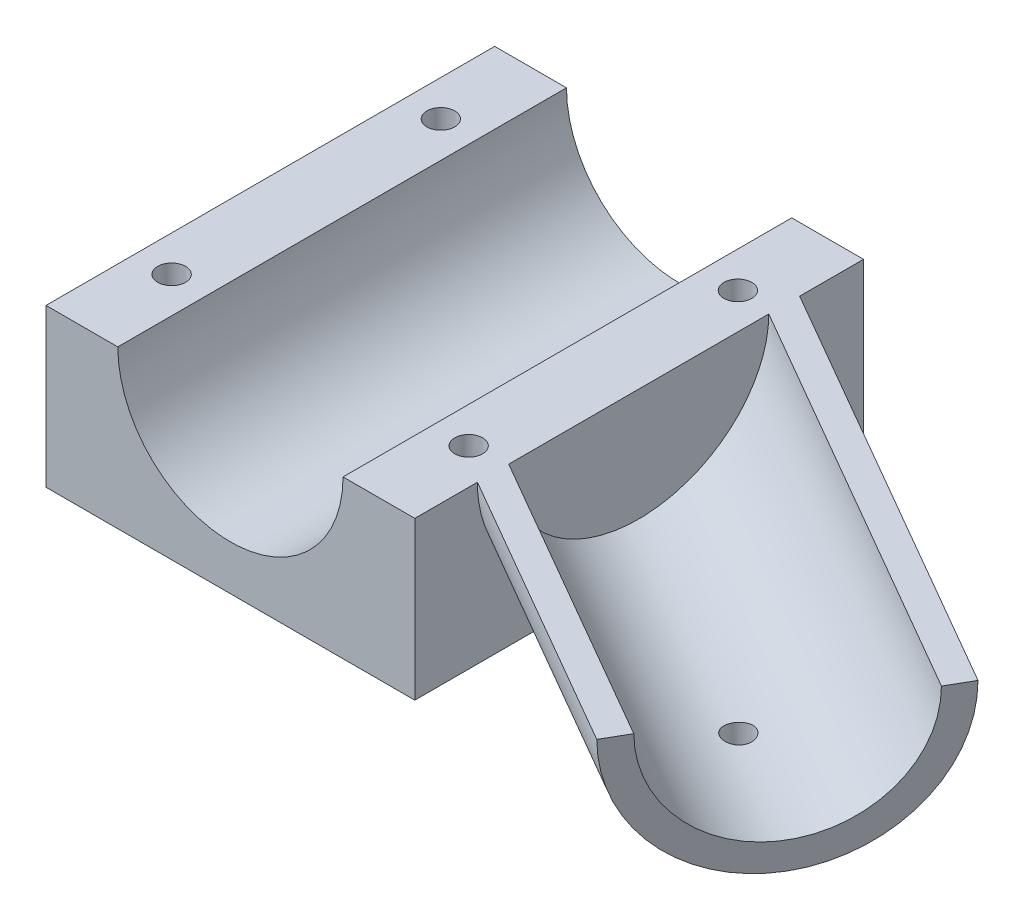
ISO-10303-21;
HEADER;
FILE_DESCRIPTION(('STEP AP214'),'2;1');
FILE_NAME('part.step','',(''),(''),'','','');
FILE_SCHEMA(('AUTOMOTIVE_DESIGN { 1 0 10303 214 1 1 1 1 }'));
ENDSEC;
DATA;
#1=APPLICATION_CONTEXT('core data for automotive mechanical design processes');
#2=APPLICATION_PROTOCOL_DEFINITION('international standard','automotive_design',2000,#1);
#3=PRODUCT_CONTEXT('',#1,'mechanical');
#4=PRODUCT('Part','Part','',(#3));
#5=PRODUCT_RELATED_PRODUCT_CATEGORY('part','',(#4));
#6=PRODUCT_DEFINITION_FORMATION('','',#4);
#7=PRODUCT_DEFINITION_CONTEXT('part definition',#1,'design');
#8=PRODUCT_DEFINITION('design','',#6,#7);
#9=PRODUCT_DEFINITION_SHAPE('','',#8);
#10=(LENGTH_UNIT() NAMED_UNIT(*) SI_UNIT(.MILLI.,.METRE.));
#11=(NAMED_UNIT(*) PLANE_ANGLE_UNIT() SI_UNIT($,.RADIAN.));
#12=(NAMED_UNIT(*) SI_UNIT($,.STERADIAN.) SOLID_ANGLE_UNIT());
#13=UNCERTAINTY_MEASURE_WITH_UNIT(LENGTH_MEASURE(1.E-05),#10,'distance_accuracy_value','');
#14=(GEOMETRIC_REPRESENTATION_CONTEXT(3) GLOBAL_UNCERTAINTY_ASSIGNED_CONTEXT((#13)) GLOBAL_UNIT_ASSIGNED_CONTEXT((#10,
#11,#12)) REPRESENTATION_CONTEXT('',''));
#15=CARTESIAN_POINT('',(0.,0.,0.));
#16=DIRECTION('',(0.,0.,1.));
#17=DIRECTION('',(1.,0.,0.));
#18=AXIS2_PLACEMENT_3D('',#15,#16,#17);
#19=CARTESIAN_POINT('',(20.55,0.,25.));
#20=DIRECTION('',(-1.,0.,0.));
#21=DIRECTION('',(0.,0.,1.));
#22=AXIS2_PLACEMENT_3D('',#19,#20,#21);
#23=PLANE('',#22);
#24=CARTESIAN_POINT('',(20.55,17.55,0.0688461692518183));
#25=DIRECTION('',(-1.,0.,0.));
#26=DIRECTION('',(0.,0.,1.));
#27=AXIS2_PLACEMENT_3D('',#24,#25,#26);
#28=ELLIPSE('',#27,17.9555933717974,15.55);
#29=CARTESIAN_POINT('',(20.55,17.55,18.0244395410492));
#30=VERTEX_POINT('',#29);
#31=CARTESIAN_POINT('',(20.55,17.55,-17.8867472025455));
#32=VERTEX_POINT('',#31);
#33=EDGE_CURVE('E136',#30,#32,#28,.F.);
#34=ORIENTED_EDGE('',*,*,#33,.F.);
#35=DIRECTION('',(0.,0.,-1.));
#36=VECTOR('',#35,1.);
#37=CARTESIAN_POINT('',(20.55,17.55,25.));
#38=LINE('',#37,#36);
#39=CARTESIAN_POINT('',(20.55,17.55,25.));
#40=VERTEX_POINT('',#39);
#41=EDGE_CURVE('E122',#40,#30,#38,.T.);
#42=ORIENTED_EDGE('',*,*,#41,.F.);
#43=DIRECTION('',(0.,1.,0.));
#44=VECTOR('',#43,1.);
#45=CARTESIAN_POINT('',(20.55,0.,25.));
#46=LINE('',#45,#44);
#47=CARTESIAN_POINT('',(20.55,0.,25.));
#48=VERTEX_POINT('',#47);
#49=EDGE_CURVE('E190',#48,#40,#46,.T.);
#50=ORIENTED_EDGE('',*,*,#49,.F.);
#51=DIRECTION('',(0.,0.,-1.));
#52=VECTOR('',#51,1.);
#53=CARTESIAN_POINT('',(20.55,0.,25.));
#54=LINE('',#53,#52);
#55=CARTESIAN_POINT('',(20.55,0.,-25.));
#56=VERTEX_POINT('',#55);
#57=EDGE_CURVE('E214',#48,#56,#54,.T.);
#58=ORIENTED_EDGE('',*,*,#57,.T.);
#59=DIRECTION('',(0.,1.,0.));
#60=VECTOR('',#59,1.);
#61=CARTESIAN_POINT('',(20.55,0.,-25.));
#62=LINE('',#61,#60);
#63=CARTESIAN_POINT('',(20.55,17.55,-25.));
#64=VERTEX_POINT('',#63);
#65=EDGE_CURVE('E203',#56,#64,#62,.T.);
#66=ORIENTED_EDGE('',*,*,#65,.T.);
#67=EDGE_CURVE('E57',#32,#64,#38,.T.);
#68=ORIENTED_EDGE('',*,*,#67,.F.);
#69=EDGE_LOOP('',(#34,#42,#50,#58,#66,#68));
#70=FACE_BOUND('',#69,.T.);
#71=ADVANCED_FACE('F36',(#70),#23,.F.);
#72=CARTESIAN_POINT('',(20.55,17.55,0.0459838096834968));
#73=DIRECTION('',(-1.,0.,0.));
#74=DIRECTION('',(0.,0.,1.));
#75=AXIS2_PLACEMENT_3D('',#72,#73,#74);
#76=ELLIPSE('',#75,14.4914917566596,12.55);
#77=CARTESIAN_POINT('',(20.55,17.55,-14.4455079469761));
#78=VERTEX_POINT('',#77);
#79=CARTESIAN_POINT('',(20.55,17.55,14.5374755663431));
#80=VERTEX_POINT('',#79);
#81=EDGE_CURVE('E64',#78,#80,#76,.T.);
#82=ORIENTED_EDGE('',*,*,#81,.F.);
#83=EDGE_CURVE('E116',#80,#78,#38,.T.);
#84=ORIENTED_EDGE('',*,*,#83,.F.);
#85=EDGE_LOOP('',(#82,#84));
#86=FACE_BOUND('',#85,.T.);
#87=ADVANCED_FACE('F118',(#86),#23,.F.);
#88=CARTESIAN_POINT('',(-20.55,17.55,25.));
#89=DIRECTION('',(0.,-1.,0.));
#90=DIRECTION('',(0.,0.,-1.));
#91=AXIS2_PLACEMENT_3D('',#88,#89,#90);
#92=PLANE('',#91);
#93=CARTESIAN_POINT('',(-16.55,17.55,15.));
#94=DIRECTION('',(0.,1.,0.));
#95=DIRECTION('',(0.,0.,1.));
#96=AXIS2_PLACEMENT_3D('',#93,#94,#95);
#97=CIRCLE('',#96,1.55);
#98=CARTESIAN_POINT('',(-16.55,17.55,16.55));
#99=VERTEX_POINT('',#98);
#100=EDGE_CURVE('E157',#99,#99,#97,.T.);
#101=ORIENTED_EDGE('',*,*,#100,.F.);
#102=EDGE_LOOP('',(#101));
#103=FACE_BOUND('',#102,.T.);
#104=CARTESIAN_POINT('',(-16.55,17.55,-15.));
#105=DIRECTION('',(0.,1.,0.));
#106=DIRECTION('',(0.,0.,1.));
#107=AXIS2_PLACEMENT_3D('',#104,#105,#106);
#108=CIRCLE('',#107,1.55);
#109=CARTESIAN_POINT('',(-16.55,17.55,-13.45));
#110=VERTEX_POINT('',#109);
#111=EDGE_CURVE('E165',#110,#110,#108,.T.);
#112=ORIENTED_EDGE('',*,*,#111,.F.);
#113=EDGE_LOOP('',(#112));
#114=FACE_BOUND('',#113,.T.);
#115=DIRECTION('',(-1.,0.,0.));
#116=VECTOR('',#115,1.);
#117=CARTESIAN_POINT('',(-20.55,17.55,-25.));
#118=LINE('',#117,#116);
#119=CARTESIAN_POINT('',(-12.55,17.55,-25.));
#120=VERTEX_POINT('',#119);
#121=CARTESIAN_POINT('',(-20.55,17.55,-25.));
#122=VERTEX_POINT('',#121);
#123=EDGE_CURVE('E181',#120,#122,#118,.T.);
#124=ORIENTED_EDGE('',*,*,#123,.T.);
#125=DIRECTION('',(0.,0.,-1.));
#126=VECTOR('',#125,1.);
#127=CARTESIAN_POINT('',(-20.55,17.55,25.));
#128=LINE('',#127,#126);
#129=CARTESIAN_POINT('',(-20.55,17.55,25.));
#130=VERTEX_POINT('',#129);
#131=EDGE_CURVE('E11',#130,#122,#128,.T.);
#132=ORIENTED_EDGE('',*,*,#131,.F.);
#133=DIRECTION('',(-1.,0.,0.));
#134=VECTOR('',#133,1.);
#135=CARTESIAN_POINT('',(-20.55,17.55,25.));
#136=LINE('',#135,#134);
#137=CARTESIAN_POINT('',(-12.55,17.55,25.));
#138=VERTEX_POINT('',#137);
#139=EDGE_CURVE('E182',#138,#130,#136,.T.);
#140=ORIENTED_EDGE('',*,*,#139,.F.);
#141=DIRECTION('',(0.,0.,-1.));
#142=VECTOR('',#141,1.);
#143=CARTESIAN_POINT('',(-12.55,17.55,25.));
#144=LINE('',#143,#142);
#145=EDGE_CURVE('E196',#138,#120,#144,.T.);
#146=ORIENTED_EDGE('',*,*,#145,.T.);
#147=EDGE_LOOP('',(#124,#132,#140,#146));
#148=FACE_BOUND('',#147,.T.);
#149=ADVANCED_FACE('F38',(#103,#114,#148),#92,.F.);
#150=CARTESIAN_POINT('',(-20.55,17.55,25.));
#151=DIRECTION('',(1.,0.,0.));
#152=DIRECTION('',(0.,0.,-1.));
#153=AXIS2_PLACEMENT_3D('',#150,#151,#152);
#154=PLANE('',#153);
#155=DIRECTION('',(0.,-1.,0.));
#156=VECTOR('',#155,1.);
#157=CARTESIAN_POINT('',(-20.55,17.55,-25.));
#158=LINE('',#157,#156);
#159=CARTESIAN_POINT('',(-20.55,0.,-25.));
#160=VERTEX_POINT('',#159);
#161=EDGE_CURVE('E199',#122,#160,#158,.T.);
#162=ORIENTED_EDGE('',*,*,#161,.T.);
#163=DIRECTION('',(0.,0.,-1.));
#164=VECTOR('',#163,1.);
#165=CARTESIAN_POINT('',(-20.55,0.,25.));
#166=LINE('',#165,#164);
#167=CARTESIAN_POINT('',(-20.55,0.,25.));
#168=VERTEX_POINT('',#167);
#169=EDGE_CURVE('E50',#168,#160,#166,.T.);
#170=ORIENTED_EDGE('',*,*,#169,.F.);
#171=DIRECTION('',(0.,-1.,0.));
#172=VECTOR('',#171,1.);
#173=CARTESIAN_POINT('',(-20.55,17.55,25.));
#174=LINE('',#173,#172);
#175=EDGE_CURVE('E185',#130,#168,#174,.T.);
#176=ORIENTED_EDGE('',*,*,#175,.F.);
#177=ORIENTED_EDGE('',*,*,#131,.T.);
#178=EDGE_LOOP('',(#162,#170,#176,#177));
#179=FACE_BOUND('',#178,.T.);
#180=ADVANCED_FACE('F239',(#179),#154,.F.);
#181=CARTESIAN_POINT('',(-20.55,0.,25.));
#182=DIRECTION('',(0.,1.,0.));
#183=DIRECTION('',(0.,0.,1.));
#184=AXIS2_PLACEMENT_3D('',#181,#182,#183);
#185=PLANE('',#184);
#186=CARTESIAN_POINT('',(-16.55,0.,15.));
#187=DIRECTION('',(0.,1.,0.));
#188=DIRECTION('',(0.,0.,1.));
#189=AXIS2_PLACEMENT_3D('',#186,#187,#188);
#190=CIRCLE('',#189,1.55);
#191=CARTESIAN_POINT('',(-16.55,0.,16.55));
#192=VERTEX_POINT('',#191);
#193=EDGE_CURVE('E169',#192,#192,#190,.F.);
#194=ORIENTED_EDGE('',*,*,#193,.F.);
#195=EDGE_LOOP('',(#194));
#196=FACE_BOUND('',#195,.T.);
#197=CARTESIAN_POINT('',(16.55,0.,15.));
#198=DIRECTION('',(0.,1.,0.));
#199=DIRECTION('',(0.,0.,1.));
#200=AXIS2_PLACEMENT_3D('',#197,#198,#199);
#201=CIRCLE('',#200,1.55);
#202=CARTESIAN_POINT('',(16.55,0.,16.55));
#203=VERTEX_POINT('',#202);
#204=EDGE_CURVE('E162',#203,#203,#201,.F.);
#205=ORIENTED_EDGE('',*,*,#204,.F.);
#206=EDGE_LOOP('',(#205));
#207=FACE_BOUND('',#206,.T.);
#208=CARTESIAN_POINT('',(16.55,0.,-15.));
#209=DIRECTION('',(0.,1.,0.));
#210=DIRECTION('',(0.,0.,1.));
#211=AXIS2_PLACEMENT_3D('',#208,#209,#210);
#212=CIRCLE('',#211,1.55);
#213=CARTESIAN_POINT('',(16.55,0.,-13.45));
#214=VERTEX_POINT('',#213);
#215=EDGE_CURVE('E161',#214,#214,#212,.F.);
#216=ORIENTED_EDGE('',*,*,#215,.F.);
#217=EDGE_LOOP('',(#216));
#218=FACE_BOUND('',#217,.T.);
#219=CARTESIAN_POINT('',(-16.55,0.,-15.));
#220=DIRECTION('',(0.,1.,0.));
#221=DIRECTION('',(0.,0.,1.));
#222=AXIS2_PLACEMENT_3D('',#219,#220,#221);
#223=CIRCLE('',#222,1.55);
#224=CARTESIAN_POINT('',(-16.55,0.,-13.45));
#225=VERTEX_POINT('',#224);
#226=EDGE_CURVE('E178',#225,#225,#223,.F.);
#227=ORIENTED_EDGE('',*,*,#226,.F.);
#228=EDGE_LOOP('',(#227));
#229=FACE_BOUND('',#228,.T.);
#230=DIRECTION('',(1.,0.,0.));
#231=VECTOR('',#230,1.);
#232=CARTESIAN_POINT('',(-20.55,0.,-25.));
#233=LINE('',#232,#231);
#234=EDGE_CURVE('E201',#160,#56,#233,.T.);
#235=ORIENTED_EDGE('',*,*,#234,.T.);
#236=ORIENTED_EDGE('',*,*,#57,.F.);
#237=DIRECTION('',(1.,0.,0.));
#238=VECTOR('',#237,1.);
#239=CARTESIAN_POINT('',(-20.55,0.,25.));
#240=LINE('',#239,#238);
#241=EDGE_CURVE('E188',#168,#48,#240,.T.);
#242=ORIENTED_EDGE('',*,*,#241,.F.);
#243=ORIENTED_EDGE('',*,*,#169,.T.);
#244=EDGE_LOOP('',(#235,#236,#242,#243));
#245=FACE_BOUND('',#244,.T.);
#246=ADVANCED_FACE('F222',(#196,#207,#218,#229,#245),#185,.F.);
#247=CARTESIAN_POINT('',(20.55,17.55,25.));
#248=DIRECTION('',(0.,-1.,0.));
#249=DIRECTION('',(0.,0.,-1.));
#250=AXIS2_PLACEMENT_3D('',#247,#248,#249);
#251=PLANE('',#250);
#252=CARTESIAN_POINT('',(16.55,17.55,15.));
#253=DIRECTION('',(0.,1.,0.));
#254=DIRECTION('',(0.,0.,1.));
#255=AXIS2_PLACEMENT_3D('',#252,#253,#254);
#256=CIRCLE('',#255,1.55);
#257=CARTESIAN_POINT('',(16.55,17.55,16.55));
#258=VERTEX_POINT('',#257);
#259=EDGE_CURVE('E166',#258,#258,#256,.T.);
#260=ORIENTED_EDGE('',*,*,#259,.F.);
#261=EDGE_LOOP('',(#260));
#262=FACE_BOUND('',#261,.T.);
#263=CARTESIAN_POINT('',(16.55,17.55,-15.));
#264=DIRECTION('',(0.,1.,0.));
#265=DIRECTION('',(0.,0.,1.));
#266=AXIS2_PLACEMENT_3D('',#263,#264,#265);
#267=CIRCLE('',#266,1.55);
#268=CARTESIAN_POINT('',(16.55,17.55,-13.45));
#269=VERTEX_POINT('',#268);
#270=EDGE_CURVE('E158',#269,#269,#267,.T.);
#271=ORIENTED_EDGE('',*,*,#270,.F.);
#272=EDGE_LOOP('',(#271));
#273=FACE_BOUND('',#272,.T.);
#274=DIRECTION('',(-1.,0.,0.));
#275=VECTOR('',#274,1.);
#276=CARTESIAN_POINT('',(20.55,17.55,-25.));
#277=LINE('',#276,#275);
#278=CARTESIAN_POINT('',(12.55,17.55,-25.));
#279=VERTEX_POINT('',#278);
#280=EDGE_CURVE('E205',#64,#279,#277,.T.);
#281=ORIENTED_EDGE('',*,*,#280,.T.);
#282=DIRECTION('',(0.,0.,-1.));
#283=VECTOR('',#282,1.);
#284=CARTESIAN_POINT('',(12.55,17.55,25.));
#285=LINE('',#284,#283);
#286=CARTESIAN_POINT('',(12.55,17.55,25.));
#287=VERTEX_POINT('',#286);
#288=EDGE_CURVE('E210',#287,#279,#285,.T.);
#289=ORIENTED_EDGE('',*,*,#288,.F.);
#290=DIRECTION('',(-1.,0.,0.));
#291=VECTOR('',#290,1.);
#292=CARTESIAN_POINT('',(20.55,17.55,25.));
#293=LINE('',#292,#291);
#294=EDGE_CURVE('E192',#40,#287,#293,.T.);
#295=ORIENTED_EDGE('',*,*,#294,.F.);
#296=ORIENTED_EDGE('',*,*,#41,.T.);
#297=DIRECTION('',(-0.866025403784438,0.,-0.500000000000001));
#298=VECTOR('',#297,1.);
#299=CARTESIAN_POINT('',(52.0175340371084,17.55,36.1922287881075));
#300=LINE('',#299,#298);
#301=CARTESIAN_POINT('',(52.0175340371084,17.55,36.1922287881075));
#302=VERTEX_POINT('',#301);
#303=EDGE_CURVE('E133',#302,#30,#300,.T.);
#304=ORIENTED_EDGE('',*,*,#303,.F.);
#305=DIRECTION('',(-0.500000000000001,0.,0.866025403784438));
#306=VECTOR('',#305,1.);
#307=CARTESIAN_POINT('',(52.0175340371084,17.55,36.1922287881075));
#308=LINE('',#307,#306);
#309=CARTESIAN_POINT('',(53.5274337291968,17.55,33.5770058070779));
#310=VERTEX_POINT('',#309);
#311=EDGE_CURVE('E129',#310,#302,#308,.T.);
#312=ORIENTED_EDGE('',*,*,#311,.F.);
#313=DIRECTION('',(-0.866025403784438,0.,-0.500000000000001));
#314=VECTOR('',#313,1.);
#315=CARTESIAN_POINT('',(53.5274337291968,17.55,33.5770058070779));
#316=LINE('',#315,#314);
#317=EDGE_CURVE('E126',#310,#80,#316,.T.);
#318=ORIENTED_EDGE('',*,*,#317,.T.);
#319=ORIENTED_EDGE('',*,*,#83,.T.);
#320=DIRECTION('',(-0.866025403784438,0.,-0.500000000000001));
#321=VECTOR('',#320,1.);
#322=CARTESIAN_POINT('',(66.0774337291968,17.55,11.8397681720886));
#323=LINE('',#322,#321);
#324=CARTESIAN_POINT('',(66.0774337291968,17.55,11.8397681720886));
#325=VERTEX_POINT('',#324);
#326=EDGE_CURVE('E132',#325,#78,#323,.T.);
#327=ORIENTED_EDGE('',*,*,#326,.F.);
#328=DIRECTION('',(-0.500000000000001,0.,0.866025403784438));
#329=VECTOR('',#328,1.);
#330=CARTESIAN_POINT('',(66.0774337291968,17.55,11.8397681720886));
#331=LINE('',#330,#329);
#332=CARTESIAN_POINT('',(67.5675340371085,17.55,9.25883873041148));
#333=VERTEX_POINT('',#332);
#334=EDGE_CURVE('E147',#333,#325,#331,.T.);
#335=ORIENTED_EDGE('',*,*,#334,.F.);
#336=DIRECTION('',(-0.866025403784438,0.,-0.500000000000001));
#337=VECTOR('',#336,1.);
#338=CARTESIAN_POINT('',(67.5675340371085,17.55,9.25883873041148));
#339=LINE('',#338,#337);
#340=EDGE_CURVE('E155',#333,#32,#339,.T.);
#341=ORIENTED_EDGE('',*,*,#340,.T.);
#342=ORIENTED_EDGE('',*,*,#67,.T.);
#343=EDGE_LOOP('',(#281,#289,#295,#296,#304,#312,#318,#319,#327,#335,#341,#342));
#344=FACE_BOUND('',#343,.T.);
#345=ADVANCED_FACE('F127',(#262,#273,#344),#251,.F.);
#346=CARTESIAN_POINT('',(0.,17.55,25.));
#347=DIRECTION('',(0.,0.,-1.));
#348=DIRECTION('',(-1.,0.,0.));
#349=AXIS2_PLACEMENT_3D('',#346,#347,#348);
#350=CYLINDRICAL_SURFACE('',#349,12.55);
#351=CARTESIAN_POINT('',(0.,17.55,-25.));
#352=DIRECTION('',(0.,0.,-1.));
#353=DIRECTION('',(1.,0.,0.));
#354=AXIS2_PLACEMENT_3D('',#351,#352,#353);
#355=CIRCLE('',#354,12.55);
#356=EDGE_CURVE('E186',#279,#120,#355,.T.);
#357=ORIENTED_EDGE('',*,*,#356,.T.);
#358=ORIENTED_EDGE('',*,*,#145,.F.);
#359=CARTESIAN_POINT('',(0.,17.55,25.));
#360=DIRECTION('',(0.,0.,-1.));
#361=DIRECTION('',(1.,0.,0.));
#362=AXIS2_PLACEMENT_3D('',#359,#360,#361);
#363=CIRCLE('',#362,12.55);
#364=EDGE_CURVE('E194',#287,#138,#363,.T.);
#365=ORIENTED_EDGE('',*,*,#364,.F.);
#366=ORIENTED_EDGE('',*,*,#288,.T.);
#367=EDGE_LOOP('',(#357,#358,#365,#366));
#368=FACE_BOUND('',#367,.T.);
#369=ADVANCED_FACE('F243',(#368),#350,.F.);
#370=CARTESIAN_POINT('',(0.,17.55,25.));
#371=DIRECTION('',(0.,0.,1.));
#372=DIRECTION('',(1.,0.,0.));
#373=AXIS2_PLACEMENT_3D('',#370,#371,#372);
#374=PLANE('',#373);
#375=ORIENTED_EDGE('',*,*,#139,.T.);
#376=ORIENTED_EDGE('',*,*,#175,.T.);
#377=ORIENTED_EDGE('',*,*,#241,.T.);
#378=ORIENTED_EDGE('',*,*,#49,.T.);
#379=ORIENTED_EDGE('',*,*,#294,.T.);
#380=ORIENTED_EDGE('',*,*,#364,.T.);
#381=EDGE_LOOP('',(#375,#376,#377,#378,#379,#380));
#382=FACE_BOUND('',#381,.T.);
#383=ADVANCED_FACE('F235',(#382),#374,.T.);
#384=CARTESIAN_POINT('',(0.,17.55,-25.));
#385=DIRECTION('',(0.,0.,1.));
#386=DIRECTION('',(1.,0.,0.));
#387=AXIS2_PLACEMENT_3D('',#384,#385,#386);
#388=PLANE('',#387);
#389=ORIENTED_EDGE('',*,*,#123,.F.);
#390=ORIENTED_EDGE('',*,*,#356,.F.);
#391=ORIENTED_EDGE('',*,*,#280,.F.);
#392=ORIENTED_EDGE('',*,*,#65,.F.);
#393=ORIENTED_EDGE('',*,*,#234,.F.);
#394=ORIENTED_EDGE('',*,*,#161,.F.);
#395=EDGE_LOOP('',(#389,#390,#391,#392,#393,#394));
#396=FACE_BOUND('',#395,.T.);
#397=ADVANCED_FACE('F228',(#396),#388,.F.);
#398=CARTESIAN_POINT('',(16.55,-4.38406204335659,-15.));
#399=DIRECTION('',(0.,1.,0.));
#400=DIRECTION('',(0.,0.,1.));
#401=AXIS2_PLACEMENT_3D('',#398,#399,#400);
#402=CYLINDRICAL_SURFACE('',#401,1.55);
#403=ORIENTED_EDGE('',*,*,#215,.T.);
#404=EDGE_LOOP('',(#403));
#405=FACE_BOUND('',#404,.T.);
#406=ORIENTED_EDGE('',*,*,#270,.T.);
#407=EDGE_LOOP('',(#406));
#408=FACE_BOUND('',#407,.T.);
#409=ADVANCED_FACE('F294',(#405,#408),#402,.F.);
#410=CARTESIAN_POINT('',(16.55,-4.38406204335659,15.));
#411=DIRECTION('',(0.,1.,0.));
#412=DIRECTION('',(0.,0.,1.));
#413=AXIS2_PLACEMENT_3D('',#410,#411,#412);
#414=CYLINDRICAL_SURFACE('',#413,1.55);
#415=ORIENTED_EDGE('',*,*,#204,.T.);
#416=EDGE_LOOP('',(#415));
#417=FACE_BOUND('',#416,.T.);
#418=ORIENTED_EDGE('',*,*,#259,.T.);
#419=EDGE_LOOP('',(#418));
#420=FACE_BOUND('',#419,.T.);
#421=ADVANCED_FACE('F285',(#417,#420),#414,.F.);
#422=CARTESIAN_POINT('',(-16.55,-4.38406204335659,-15.));
#423=DIRECTION('',(0.,1.,0.));
#424=DIRECTION('',(0.,0.,1.));
#425=AXIS2_PLACEMENT_3D('',#422,#423,#424);
#426=CYLINDRICAL_SURFACE('',#425,1.55);
#427=ORIENTED_EDGE('',*,*,#226,.T.);
#428=EDGE_LOOP('',(#427));
#429=FACE_BOUND('',#428,.T.);
#430=ORIENTED_EDGE('',*,*,#111,.T.);
#431=EDGE_LOOP('',(#430));
#432=FACE_BOUND('',#431,.T.);
#433=ADVANCED_FACE('F282',(#429,#432),#426,.F.);
#434=CARTESIAN_POINT('',(-16.55,-4.38406204335659,15.));
#435=DIRECTION('',(0.,1.,0.));
#436=DIRECTION('',(0.,0.,1.));
#437=AXIS2_PLACEMENT_3D('',#434,#435,#436);
#438=CYLINDRICAL_SURFACE('',#437,1.55);
#439=ORIENTED_EDGE('',*,*,#193,.T.);
#440=EDGE_LOOP('',(#439));
#441=FACE_BOUND('',#440,.T.);
#442=ORIENTED_EDGE('',*,*,#100,.T.);
#443=EDGE_LOOP('',(#442));
#444=FACE_BOUND('',#443,.T.);
#445=ADVANCED_FACE('F284',(#441,#444),#438,.F.);
#446=CARTESIAN_POINT('',(59.7925340371085,17.55,22.7255337592595));
#447=DIRECTION('',(-0.866025403784438,0.,-0.500000000000001));
#448=DIRECTION('',(-0.500000000000001,0.,0.866025403784438));
#449=AXIS2_PLACEMENT_3D('',#446,#447,#448);
#450=CYLINDRICAL_SURFACE('',#449,15.55);
#451=CARTESIAN_POINT('',(45.2620526724303,2.01834934625878,15.2083869895832));
#452=CARTESIAN_POINT('',(45.2620562797275,2.01469685331987,15.1216323159421));
#453=CARTESIAN_POINT('',(45.2693595591901,2.01141369707547,15.0348059463757));
#454=CARTESIAN_POINT('',(45.2984092968145,2.00596566590557,14.863501746858));
#455=CARTESIAN_POINT('',(45.3201708331823,2.0038019626281,14.7790264647302));
#456=CARTESIAN_POINT('',(45.3775378676029,2.0008482573498,14.6149070166333));
#457=CARTESIAN_POINT('',(45.4131394806538,2.00005787019022,14.5352615021625));
#458=CARTESIAN_POINT('',(45.4971698744395,1.99994831567961,14.3830761834491));
#459=CARTESIAN_POINT('',(45.5455957650445,2.0006288170905,14.3105347832347));
#460=CARTESIAN_POINT('',(45.6537851281487,2.00339023484947,14.1747342481469));
#461=CARTESIAN_POINT('',(45.7135260188987,2.00546838258569,14.1114570628718));
#462=CARTESIAN_POINT('',(45.8427100654244,2.01079922202937,13.9957895357711));
#463=CARTESIAN_POINT('',(45.9121537145492,2.01405197347437,13.9433997478662));
#464=CARTESIAN_POINT('',(46.0589566095821,2.02138712782917,13.8508549263606));
#465=CARTESIAN_POINT('',(46.1363343937672,2.02547149681544,13.8107294605233));
#466=CARTESIAN_POINT('',(46.296694929329,2.03401722611677,13.7439931720733));
#467=CARTESIAN_POINT('',(46.3796778318781,2.03847859660054,13.717382714131));
#468=CARTESIAN_POINT('',(46.5492899821705,2.04730598860176,13.6783345054542));
#469=CARTESIAN_POINT('',(46.6359331261437,2.05167152890846,13.665956971203));
#470=CARTESIAN_POINT('',(46.8100961426893,2.05980062841057,13.655935926056));
#471=CARTESIAN_POINT('',(46.8976160106948,2.0635641907399,13.658292338452));
#472=CARTESIAN_POINT('',(47.0710094109769,2.0700647347612,13.6776853282408));
#473=CARTESIAN_POINT('',(47.1568837630541,2.0728022409573,13.6947143904734));
#474=CARTESIAN_POINT('',(47.3245774277355,2.07694349879175,13.7429756769033));
#475=CARTESIAN_POINT('',(47.406396865137,2.07834729150172,13.7742074636849));
#476=CARTESIAN_POINT('',(47.5632724308306,2.07965856171468,13.8498155763005));
#477=CARTESIAN_POINT('',(47.6383575569829,2.07957279834668,13.8941316293251));
#478=CARTESIAN_POINT('',(47.7800402799468,2.07793126424763,13.9946956627242));
#479=CARTESIAN_POINT('',(47.8466379623178,2.07637550833646,14.0509435228026));
#480=CARTESIAN_POINT('',(47.9693665149924,2.07197283546201,14.1736675495795));
#481=CARTESIAN_POINT('',(48.0255133285082,2.06912790833663,14.240127849265));
#482=CARTESIAN_POINT('',(48.1259028598735,2.06246526594468,14.3814581452478));
#483=CARTESIAN_POINT('',(48.1701452698596,2.05864752552485,14.4563283589655));
#484=CARTESIAN_POINT('',(48.2456485146686,2.05044659466772,14.6126786646428));
#485=CARTESIAN_POINT('',(48.2768587907157,2.04606128689742,14.6941830604155));
#486=CARTESIAN_POINT('',(48.3251853150968,2.03722287689576,14.8612659301236));
#487=CARTESIAN_POINT('',(48.3423012508168,2.03276977316292,14.94684449438));
#488=CARTESIAN_POINT('',(48.3619868709628,2.02427308323591,15.1199664296992));
#489=CARTESIAN_POINT('',(48.3645085862336,2.02023089036184,15.2075153316566));
#490=CARTESIAN_POINT('',(48.3547898427005,2.01302026345162,15.3818268146634));
#491=CARTESIAN_POINT('',(48.342549621369,2.00985181536073,15.4685894083393));
#492=CARTESIAN_POINT('',(48.3036816353209,2.0047436420867,15.6386590553296));
#493=CARTESIAN_POINT('',(48.2770869193939,2.00280111662275,15.7219735747));
#494=CARTESIAN_POINT('',(48.2102770134152,2.00034338035155,15.8829713764081));
#495=CARTESIAN_POINT('',(48.1700622172103,1.99982812827634,15.9606548214987));
#496=CARTESIAN_POINT('',(48.0773595729914,2.00027267259672,16.1078488454185));
#497=CARTESIAN_POINT('',(48.0249244757904,2.00122622520313,16.177392674746));
#498=CARTESIAN_POINT('',(47.9091851000029,2.00448066574621,16.3067178646045));
#499=CARTESIAN_POINT('',(47.8458807870395,2.00678155794428,16.3664991942577));
#500=CARTESIAN_POINT('',(47.7101792054342,2.01246566224603,16.4746409372678));
#501=CARTESIAN_POINT('',(47.6377787188868,2.01584925803061,16.522997291346));
#502=CARTESIAN_POINT('',(47.4859427936196,2.0233130882352,16.606920869349));
#503=CARTESIAN_POINT('',(47.4065071569013,2.02739334226507,16.6424877331818));
#504=CARTESIAN_POINT('',(47.2424667128143,2.03580721431312,16.6999732842581));
#505=CARTESIAN_POINT('',(47.1578410325241,2.04014185191152,16.7218322711379));
#506=CARTESIAN_POINT('',(46.9861083103504,2.04855494527717,16.7510441634007));
#507=CARTESIAN_POINT('',(46.899001237705,2.05263339786647,16.75839688887));
#508=CARTESIAN_POINT('',(46.7246188928896,2.06007455227719,16.758377055158));
#509=CARTESIAN_POINT('',(46.6373435712225,2.06343612124526,16.7509813779487));
#510=CARTESIAN_POINT('',(46.4652448036077,2.0690484416967,16.7216100123197));
#511=CARTESIAN_POINT('',(46.3804212983981,2.07129922004977,16.699634676608));
#512=CARTESIAN_POINT('',(46.2159549143113,2.07442395305402,16.6418226922508));
#513=CARTESIAN_POINT('',(46.1362944276845,2.07530285201758,16.60603640345));
#514=CARTESIAN_POINT('',(45.98410207913,2.07559801333074,16.5216156125232));
#515=CARTESIAN_POINT('',(45.9115698209673,2.07501435702688,16.4729818251028));
#516=CARTESIAN_POINT('',(45.7759170054817,2.07245612277332,16.3644343801175));
#517=CARTESIAN_POINT('',(45.7127671383493,2.07048599163365,16.3045572320754));
#518=CARTESIAN_POINT('',(45.5973629978163,2.06538415944531,16.1751076151614));
#519=CARTESIAN_POINT('',(45.5451113342142,2.06225218066616,16.1055328306306));
#520=CARTESIAN_POINT('',(45.4528492743894,2.05517345662561,15.9584703064918));
#521=CARTESIAN_POINT('',(45.4128729836981,2.05122449145698,15.8809613042333));
#522=CARTESIAN_POINT('',(45.3464968233379,2.04296883346829,15.7204182302447));
#523=CARTESIAN_POINT('',(45.3200826618955,2.03866252280282,15.6373900792744));
#524=CARTESIAN_POINT('',(45.2879336350294,2.03159278533543,15.4963452206456));
#525=CARTESIAN_POINT('',(45.2782422193021,2.02879283721729,15.4392005887693));
#526=CARTESIAN_POINT('',(45.2653005193389,2.02339018327466,15.3241769523562));
#527=CARTESIAN_POINT('',(45.2620502644674,2.02078747834944,15.2662979444728));
#528=CARTESIAN_POINT('',(45.2620526724303,2.01834934625878,15.2083869895832));
#529=B_SPLINE_CURVE_WITH_KNOTS('',3,(#451,#452,#453,#454,#455,#456,#457,#458,#459,#460,#461,
#462,#463,#464,#465,#466,#467,#468,#469,#470,#471,#472,#473,#474,#475,#476,#477,#478,#479,#480,
#481,#482,#483,#484,#485,#486,#487,#488,#489,#490,#491,#492,#493,#494,#495,#496,#497,#498,#499,
#500,#501,#502,#503,#504,#505,#506,#507,#508,#509,#510,#511,#512,#513,#514,#515,#516,#517,#518,
#519,#520,#521,#522,#523,#524,#525,#526,#527,#528),.UNSPECIFIED.,.T.,.F.,(4,2,2,2,2,2,2,2,2,2,2,
2,2,2,2,2,2,2,2,2,2,2,2,2,2,2,2,2,2,2,2,2,2,2,2,2,2,2,4),(0.,0.260284883114379,
0.520841638723967,0.781325307064864,1.04175032166477,1.30166097125373,1.56158484114132,
1.82213050043531,2.0826831895632,2.34433421242809,2.60598387308026,2.86749959943789,
3.12900727217386,3.38932861801682,3.6496473394308,3.90956561991528,4.16949062158147,
4.43041485027408,4.69134486613953,4.95313203742489,5.21491499745008,5.47609780160298,
5.73727305387621,5.997341127901,6.25741002447923,6.51757118470259,6.77773966927053,
7.03903350743015,7.30033058626466,7.56203756856264,7.82373821993252,8.08449349505506,
8.34523426742978,8.60514256057107,8.8651130228081,9.12579937683316,9.38621045279293,
9.55995645141885,9.73370324213154),.UNSPECIFIED.);
#530=CARTESIAN_POINT('',(45.2620526724303,2.01834934625878,15.2083869895832));
#531=VERTEX_POINT('',#530);
#532=EDGE_CURVE('E142',#531,#531,#529,.T.);
#533=ORIENTED_EDGE('',*,*,#532,.F.);
#534=EDGE_LOOP('',(#533));
#535=FACE_BOUND('',#534,.T.);
#536=ORIENTED_EDGE('',*,*,#303,.T.);
#537=ORIENTED_EDGE('',*,*,#33,.T.);
#538=ORIENTED_EDGE('',*,*,#340,.F.);
#539=CARTESIAN_POINT('',(59.7925340371085,17.55,22.7255337592595));
#540=DIRECTION('',(0.866025403784438,0.,0.500000000000001));
#541=DIRECTION('',(0.500000000000001,0.,-0.866025403784438));
#542=AXIS2_PLACEMENT_3D('',#539,#540,#541);
#543=CIRCLE('',#542,15.55);
#544=EDGE_CURVE('E139',#302,#333,#543,.T.);
#545=ORIENTED_EDGE('',*,*,#544,.F.);
#546=EDGE_LOOP('',(#536,#537,#538,#545));
#547=FACE_BOUND('',#546,.T.);
#548=ADVANCED_FACE('F248',(#535,#547),#450,.T.);
#549=CARTESIAN_POINT('',(59.8024337291968,17.55,22.7083869895833));
#550=DIRECTION('',(-0.866025403784438,0.,-0.500000000000001));
#551=DIRECTION('',(-0.500000000000001,0.,0.866025403784438));
#552=AXIS2_PLACEMENT_3D('',#549,#550,#551);
#553=CYLINDRICAL_SURFACE('',#552,12.55);
#554=CARTESIAN_POINT('',(45.2620526724303,5.02395213964117,15.2083869895832));
#555=CARTESIAN_POINT('',(45.262056124417,5.01931305656321,15.1217928776582));
#556=CARTESIAN_POINT('',(45.2693319001513,5.01512508352438,15.0351221324813));
#557=CARTESIAN_POINT('',(45.2982818368039,5.00812218146425,14.8641008155763));
#558=CARTESIAN_POINT('',(45.3199698029918,5.00530857341912,14.7797525492798));
#559=CARTESIAN_POINT('',(45.3771591143563,5.00137319699484,14.6158412332206));
#560=CARTESIAN_POINT('',(45.4126581064121,5.00025114056803,14.5362773709564));
#561=CARTESIAN_POINT('',(45.4964584186545,4.99982465262881,14.3842226665958));
#562=CARTESIAN_POINT('',(45.54475700366,5.00051983306694,14.3117303178902));
#563=CARTESIAN_POINT('',(45.6525998758359,5.00364367812104,14.1760822926395));
#564=CARTESIAN_POINT('',(45.7121078770824,5.00606681778542,14.1128976307567));
#565=CARTESIAN_POINT('',(45.8407763943979,5.01237110872179,13.9973544505573));
#566=CARTESIAN_POINT('',(45.9099374467431,5.01625234101854,13.9449965341228));
#567=CARTESIAN_POINT('',(46.056216307194,5.0250586710897,13.8523888497396));
#568=CARTESIAN_POINT('',(46.1333609123659,5.02998734704843,13.8121817606726));
#569=CARTESIAN_POINT('',(46.29325314418,5.04033370759421,13.7452191028497));
#570=CARTESIAN_POINT('',(46.3760010066527,5.04575141276678,13.7184641006666));
#571=CARTESIAN_POINT('',(46.545355809176,5.05650938616906,13.6790144621071));
#572=CARTESIAN_POINT('',(46.6319841964664,5.06184892960861,13.6664116214943));
#573=CARTESIAN_POINT('',(46.8061690349545,5.0718114940053,13.655944510724));
#574=CARTESIAN_POINT('',(46.8937254809806,5.0764345189529,13.658080158481));
#575=CARTESIAN_POINT('',(47.0672418549305,5.08443504216129,13.6770507521357));
#576=CARTESIAN_POINT('',(47.1532026628275,5.08781324754867,13.6938773344054));
#577=CARTESIAN_POINT('',(47.3211135129501,5.0929389690124,13.7417657279664));
#578=CARTESIAN_POINT('',(47.4030637446018,5.09468656217582,13.7728268662164));
#579=CARTESIAN_POINT('',(47.5600485095126,5.09634308851316,13.8480463914256));
#580=CARTESIAN_POINT('',(47.6351262374033,5.09626443039684,13.8921143804172));
#581=CARTESIAN_POINT('',(47.7768445558563,5.09430815552953,13.9921633720145));
#582=CARTESIAN_POINT('',(47.843485272464,5.09243056565741,14.0481441966141));
#583=CARTESIAN_POINT('',(47.9662989634342,5.08709765494476,14.1702649753737));
#584=CARTESIAN_POINT('',(48.0224965449532,5.08364611090227,14.2363803603568));
#585=CARTESIAN_POINT('',(48.1230695804137,5.07555600338993,14.3769980625264));
#586=CARTESIAN_POINT('',(48.1674445808964,5.07091739440321,14.4515007012527));
#587=CARTESIAN_POINT('',(48.2433806331632,5.0609424775501,14.6072627415069));
#588=CARTESIAN_POINT('',(48.2748665112773,5.05560231000653,14.68855854283));
#589=CARTESIAN_POINT('',(48.32379169238,5.04484291094805,14.8552691090893));
#590=CARTESIAN_POINT('',(48.3412305253745,5.03942367679386,14.9406840117434));
#591=CARTESIAN_POINT('',(48.3616188424957,5.02908476289798,15.1136876789539));
#592=CARTESIAN_POINT('',(48.3644964760057,5.02416767745766,15.201285084129));
#593=CARTESIAN_POINT('',(48.3554625704982,5.01541769402677,15.3757694554575));
#594=CARTESIAN_POINT('',(48.3435513992137,5.01158476908078,15.4626564392219));
#595=CARTESIAN_POINT('',(48.3053189794284,5.00544717212109,15.63293753501));
#596=CARTESIAN_POINT('',(48.2790483867828,5.00313719044,15.7163428225792));
#597=CARTESIAN_POINT('',(48.2128634046902,5.00028489600403,15.8775828820792));
#598=CARTESIAN_POINT('',(48.1729496139823,4.99974250568847,15.955417898283));
#599=CARTESIAN_POINT('',(48.080921457014,5.00048405831622,16.1027982917071));
#600=CARTESIAN_POINT('',(48.0288869478441,5.0017563151148,16.1723936139704));
#601=CARTESIAN_POINT('',(47.9139692041188,5.00596388401893,16.3019018582953));
#602=CARTESIAN_POINT('',(47.8510859163206,5.00889920428651,16.3618147328353));
#603=CARTESIAN_POINT('',(47.7162196891147,5.01610864525839,16.4703210723534));
#604=CARTESIAN_POINT('',(47.6442312047774,5.02038358413448,16.51890758805));
#605=CARTESIAN_POINT('',(47.4932058650872,5.02979816976055,16.6033842879639));
#606=CARTESIAN_POINT('',(47.4141687011229,5.03493785438032,16.6392739159332));
#607=CARTESIAN_POINT('',(47.250690830143,5.04554967333911,16.6975738730476));
#608=CARTESIAN_POINT('',(47.1662175088557,5.05102380185368,16.7198924130956));
#609=CARTESIAN_POINT('',(46.9947034017972,5.06165960795429,16.75004861822));
#610=CARTESIAN_POINT('',(46.9076625669881,5.06682127956684,16.7578860065326));
#611=CARTESIAN_POINT('',(46.7332328882744,5.07626151568215,16.7588425103261));
#612=CARTESIAN_POINT('',(46.6458437157554,5.08053786807714,16.751925234539));
#613=CARTESIAN_POINT('',(46.4734214259977,5.08770144392483,16.723465485801));
#614=CARTESIAN_POINT('',(46.3883882159907,5.09058872214704,16.7019235895621));
#615=CARTESIAN_POINT('',(46.2235955940269,5.09462899344582,16.6449715889027));
#616=CARTESIAN_POINT('',(46.1438090596835,5.09579170880951,16.6096406581062));
#617=CARTESIAN_POINT('',(45.9912822934737,5.09627993336335,16.5261105796271));
#618=CARTESIAN_POINT('',(45.9185415982949,5.09560556343951,16.4779122788461));
#619=CARTESIAN_POINT('',(45.7825316134808,5.09250565204691,16.3703113913293));
#620=CARTESIAN_POINT('',(45.719216169894,5.09008900710082,16.3109668542331));
#621=CARTESIAN_POINT('',(45.6033733930819,5.08378805471104,16.1825895174439));
#622=CARTESIAN_POINT('',(45.5508485813609,5.07990340483164,16.113554459645));
#623=CARTESIAN_POINT('',(45.4578675475748,5.071086452298,15.9674729222265));
#624=CARTESIAN_POINT('',(45.4174595077207,5.06615009714083,15.890396059019));
#625=CARTESIAN_POINT('',(45.350124539484,5.0557957475365,15.7306561669469));
#626=CARTESIAN_POINT('',(45.3231845131549,5.05037822709714,15.647998654559));
#627=CARTESIAN_POINT('',(45.2896302991354,5.04132568452191,15.5055539249234));
#628=CARTESIAN_POINT('',(45.2793046602373,5.03765844139592,15.44661543806));
#629=CARTESIAN_POINT('',(45.2655146341624,5.0305731627467,15.3279258110441));
#630=CARTESIAN_POINT('',(45.262050289055,5.02715512875161,15.2681746659112));
#631=CARTESIAN_POINT('',(45.2620526724303,5.02395213964117,15.2083869895832));
#632=B_SPLINE_CURVE_WITH_KNOTS('',3,(#554,#555,#556,#557,#558,#559,#560,#561,#562,#563,#564,
#565,#566,#567,#568,#569,#570,#571,#572,#573,#574,#575,#576,#577,#578,#579,#580,#581,#582,#583,
#584,#585,#586,#587,#588,#589,#590,#591,#592,#593,#594,#595,#596,#597,#598,#599,#600,#601,#602,
#603,#604,#605,#606,#607,#608,#609,#610,#611,#612,#613,#614,#615,#616,#617,#618,#619,#620,#621,
#622,#623,#624,#625,#626,#627,#628,#629,#630,#631),.UNSPECIFIED.,.T.,.F.,(4,2,2,2,2,2,2,2,2,2,2,
2,2,2,2,2,2,2,2,2,2,2,2,2,2,2,2,2,2,2,2,2,2,2,2,2,2,2,4),(0.,0.259939312826798,
0.520127978103935,0.780272331871585,1.04036113942429,1.29962205014457,1.55889736986542,
1.81907306452313,2.07925971629989,2.34112445149799,2.6029877282536,2.86470202197811,
3.12640394255168,3.38632821788674,3.6462486096067,3.90554856215571,4.1648584588021,
4.42565989950951,4.68647006590083,4.94856592461909,5.2106552662884,5.47182594493419,
5.73298516343621,5.99247011675035,6.25195634358248,6.51160136147317,6.77125775295122,
7.03265136302645,7.2940499688054,7.55609403994243,7.81812777815093,8.07867860114161,
8.33921227948042,8.59842494116841,8.85769810572941,9.11798899679543,9.37802625425591,
9.55749656541348,9.73696797697637),.UNSPECIFIED.);
#633=CARTESIAN_POINT('',(45.2620526724303,5.02395213964117,15.2083869895832));
#634=VERTEX_POINT('',#633);
#635=EDGE_CURVE('E40',#634,#634,#632,.T.);
#636=ORIENTED_EDGE('',*,*,#635,.T.);
#637=EDGE_LOOP('',(#636));
#638=FACE_BOUND('',#637,.T.);
#639=ORIENTED_EDGE('',*,*,#326,.T.);
#640=ORIENTED_EDGE('',*,*,#81,.T.);
#641=ORIENTED_EDGE('',*,*,#317,.F.);
#642=CARTESIAN_POINT('',(59.8024337291968,17.55,22.7083869895833));
#643=DIRECTION('',(-0.866025403784438,0.,-0.500000000000001));
#644=DIRECTION('',(0.500000000000001,0.,-0.866025403784438));
#645=AXIS2_PLACEMENT_3D('',#642,#643,#644);
#646=CIRCLE('',#645,12.55);
#647=EDGE_CURVE('E149',#325,#310,#646,.T.);
#648=ORIENTED_EDGE('',*,*,#647,.F.);
#649=EDGE_LOOP('',(#639,#640,#641,#648));
#650=FACE_BOUND('',#649,.T.);
#651=ADVANCED_FACE('F135',(#638,#650),#553,.F.);
#652=CARTESIAN_POINT('',(59.7925340371085,17.55,22.7255337592595));
#653=DIRECTION('',(0.866025403784438,0.,0.500000000000001));
#654=DIRECTION('',(0.500000000000001,0.,-0.866025403784438));
#655=AXIS2_PLACEMENT_3D('',#652,#653,#654);
#656=PLANE('',#655);
#657=ORIENTED_EDGE('',*,*,#544,.T.);
#658=ORIENTED_EDGE('',*,*,#334,.T.);
#659=ORIENTED_EDGE('',*,*,#647,.T.);
#660=ORIENTED_EDGE('',*,*,#311,.T.);
#661=EDGE_LOOP('',(#657,#658,#659,#660));
#662=FACE_BOUND('',#661,.T.);
#663=ADVANCED_FACE('F250',(#662),#656,.T.);
#664=CARTESIAN_POINT('',(46.8120526724303,-0.00100000000003569,15.2083869895832));
#665=DIRECTION('',(0.,1.,0.));
#666=DIRECTION('',(-1.,0.,0.));
#667=AXIS2_PLACEMENT_3D('',#664,#665,#666);
#668=CYLINDRICAL_SURFACE('',#667,1.55);
#669=ORIENTED_EDGE('',*,*,#532,.T.);
#670=EDGE_LOOP('',(#669));
#671=FACE_BOUND('',#670,.T.);
#672=ORIENTED_EDGE('',*,*,#635,.F.);
#673=EDGE_LOOP('',(#672));
#674=FACE_BOUND('',#673,.T.);
#675=ADVANCED_FACE('F252',(#671,#674),#668,.F.);
#676=CLOSED_SHELL('',(#71,#87,#149,#180,#246,#345,#369,#383,#397,#409,#421,#433,#445,#548,#651,
#663,#675));
#677=MANIFOLD_SOLID_BREP('B2',#676);
#678=ADVANCED_BREP_SHAPE_REPRESENTATION('',(#18,#677),#14);
#679=SHAPE_DEFINITION_REPRESENTATION(#9,#678);
ENDSEC;
END-ISO-10303-21;
